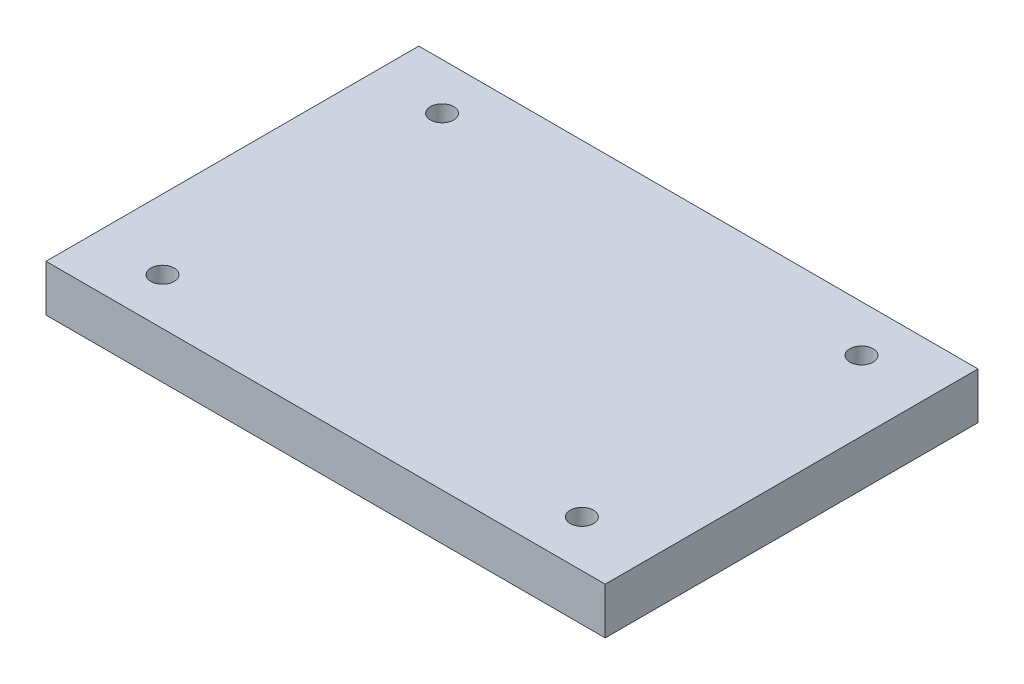
ISO-10303-21;
HEADER;
FILE_DESCRIPTION(('STEP AP214'),'2;1');
FILE_NAME('part.step','',(''),(''),'','','');
FILE_SCHEMA(('AUTOMOTIVE_DESIGN { 1 0 10303 214 1 1 1 1 }'));
ENDSEC;
DATA;
#1=APPLICATION_CONTEXT('core data for automotive mechanical design processes');
#2=APPLICATION_PROTOCOL_DEFINITION('international standard','automotive_design',2000,#1);
#3=PRODUCT_CONTEXT('',#1,'mechanical');
#4=PRODUCT('Part','Part','',(#3));
#5=PRODUCT_RELATED_PRODUCT_CATEGORY('part','',(#4));
#6=PRODUCT_DEFINITION_FORMATION('','',#4);
#7=PRODUCT_DEFINITION_CONTEXT('part definition',#1,'design');
#8=PRODUCT_DEFINITION('design','',#6,#7);
#9=PRODUCT_DEFINITION_SHAPE('','',#8);
#10=(LENGTH_UNIT() NAMED_UNIT(*) SI_UNIT(.MILLI.,.METRE.));
#11=(NAMED_UNIT(*) PLANE_ANGLE_UNIT() SI_UNIT($,.RADIAN.));
#12=(NAMED_UNIT(*) SI_UNIT($,.STERADIAN.) SOLID_ANGLE_UNIT());
#13=UNCERTAINTY_MEASURE_WITH_UNIT(LENGTH_MEASURE(1.E-05),#10,'distance_accuracy_value','');
#14=(GEOMETRIC_REPRESENTATION_CONTEXT(3) GLOBAL_UNCERTAINTY_ASSIGNED_CONTEXT((#13)) GLOBAL_UNIT_ASSIGNED_CONTEXT((#10,
#11,#12)) REPRESENTATION_CONTEXT('',''));
#15=CARTESIAN_POINT('',(0.,0.,0.));
#16=DIRECTION('',(0.,0.,1.));
#17=DIRECTION('',(1.,0.,0.));
#18=AXIS2_PLACEMENT_3D('',#15,#16,#17);
#19=CARTESIAN_POINT('',(-120.,-20.,80.));
#20=DIRECTION('',(-1.,0.,0.));
#21=DIRECTION('',(0.,0.,1.));
#22=AXIS2_PLACEMENT_3D('',#19,#20,#21);
#23=PLANE('',#22);
#24=DIRECTION('',(0.,0.,1.));
#25=VECTOR('',#24,1.);
#26=CARTESIAN_POINT('',(-120.,0.,80.));
#27=LINE('',#26,#25);
#28=CARTESIAN_POINT('',(-120.,0.,-80.));
#29=VERTEX_POINT('',#28);
#30=CARTESIAN_POINT('',(-120.,0.,80.));
#31=VERTEX_POINT('',#30);
#32=EDGE_CURVE('E102',#29,#31,#27,.T.);
#33=ORIENTED_EDGE('',*,*,#32,.F.);
#34=DIRECTION('',(0.,1.,0.));
#35=VECTOR('',#34,1.);
#36=CARTESIAN_POINT('',(-120.,-20.,-80.));
#37=LINE('',#36,#35);
#38=CARTESIAN_POINT('',(-120.,-20.,-80.));
#39=VERTEX_POINT('',#38);
#40=EDGE_CURVE('E11',#39,#29,#37,.T.);
#41=ORIENTED_EDGE('',*,*,#40,.F.);
#42=DIRECTION('',(0.,0.,1.));
#43=VECTOR('',#42,1.);
#44=CARTESIAN_POINT('',(-120.,-20.,80.));
#45=LINE('',#44,#43);
#46=CARTESIAN_POINT('',(-120.,-20.,80.));
#47=VERTEX_POINT('',#46);
#48=EDGE_CURVE('E100',#39,#47,#45,.T.);
#49=ORIENTED_EDGE('',*,*,#48,.T.);
#50=DIRECTION('',(0.,1.,0.));
#51=VECTOR('',#50,1.);
#52=CARTESIAN_POINT('',(-120.,-20.,80.));
#53=LINE('',#52,#51);
#54=EDGE_CURVE('E45',#47,#31,#53,.T.);
#55=ORIENTED_EDGE('',*,*,#54,.T.);
#56=EDGE_LOOP('',(#33,#41,#49,#55));
#57=FACE_BOUND('',#56,.T.);
#58=ADVANCED_FACE('F39',(#57),#23,.T.);
#59=CARTESIAN_POINT('',(-120.,-20.,-80.));
#60=DIRECTION('',(0.,0.,-1.));
#61=DIRECTION('',(-1.,0.,0.));
#62=AXIS2_PLACEMENT_3D('',#59,#60,#61);
#63=PLANE('',#62);
#64=DIRECTION('',(-1.,0.,0.));
#65=VECTOR('',#64,1.);
#66=CARTESIAN_POINT('',(-120.,0.,-80.));
#67=LINE('',#66,#65);
#68=CARTESIAN_POINT('',(120.,0.,-80.));
#69=VERTEX_POINT('',#68);
#70=EDGE_CURVE('E97',#69,#29,#67,.T.);
#71=ORIENTED_EDGE('',*,*,#70,.F.);
#72=DIRECTION('',(0.,1.,0.));
#73=VECTOR('',#72,1.);
#74=CARTESIAN_POINT('',(120.,-20.,-80.));
#75=LINE('',#74,#73);
#76=CARTESIAN_POINT('',(120.,-20.,-80.));
#77=VERTEX_POINT('',#76);
#78=EDGE_CURVE('E48',#77,#69,#75,.T.);
#79=ORIENTED_EDGE('',*,*,#78,.F.);
#80=DIRECTION('',(-1.,0.,0.));
#81=VECTOR('',#80,1.);
#82=CARTESIAN_POINT('',(-120.,-20.,-80.));
#83=LINE('',#82,#81);
#84=EDGE_CURVE('E94',#77,#39,#83,.T.);
#85=ORIENTED_EDGE('',*,*,#84,.T.);
#86=ORIENTED_EDGE('',*,*,#40,.T.);
#87=EDGE_LOOP('',(#71,#79,#85,#86));
#88=FACE_BOUND('',#87,.T.);
#89=ADVANCED_FACE('F113',(#88),#63,.T.);
#90=CARTESIAN_POINT('',(120.,-20.,80.));
#91=DIRECTION('',(1.,0.,0.));
#92=DIRECTION('',(0.,0.,-1.));
#93=AXIS2_PLACEMENT_3D('',#90,#91,#92);
#94=PLANE('',#93);
#95=DIRECTION('',(0.,0.,-1.));
#96=VECTOR('',#95,1.);
#97=CARTESIAN_POINT('',(120.,0.,80.));
#98=LINE('',#97,#96);
#99=CARTESIAN_POINT('',(120.,0.,80.));
#100=VERTEX_POINT('',#99);
#101=EDGE_CURVE('E90',#100,#69,#98,.T.);
#102=ORIENTED_EDGE('',*,*,#101,.F.);
#103=DIRECTION('',(0.,1.,0.));
#104=VECTOR('',#103,1.);
#105=CARTESIAN_POINT('',(120.,-20.,80.));
#106=LINE('',#105,#104);
#107=CARTESIAN_POINT('',(120.,-20.,80.));
#108=VERTEX_POINT('',#107);
#109=EDGE_CURVE('E81',#108,#100,#106,.T.);
#110=ORIENTED_EDGE('',*,*,#109,.F.);
#111=DIRECTION('',(0.,0.,-1.));
#112=VECTOR('',#111,1.);
#113=CARTESIAN_POINT('',(120.,-20.,80.));
#114=LINE('',#113,#112);
#115=EDGE_CURVE('E87',#108,#77,#114,.T.);
#116=ORIENTED_EDGE('',*,*,#115,.T.);
#117=ORIENTED_EDGE('',*,*,#78,.T.);
#118=EDGE_LOOP('',(#102,#110,#116,#117));
#119=FACE_BOUND('',#118,.T.);
#120=ADVANCED_FACE('F88',(#119),#94,.T.);
#121=CARTESIAN_POINT('',(-120.,-20.,80.));
#122=DIRECTION('',(0.,0.,1.));
#123=DIRECTION('',(1.,0.,0.));
#124=AXIS2_PLACEMENT_3D('',#121,#122,#123);
#125=PLANE('',#124);
#126=DIRECTION('',(1.,0.,0.));
#127=VECTOR('',#126,1.);
#128=CARTESIAN_POINT('',(-120.,0.,80.));
#129=LINE('',#128,#127);
#130=EDGE_CURVE('E110',#31,#100,#129,.T.);
#131=ORIENTED_EDGE('',*,*,#130,.F.);
#132=ORIENTED_EDGE('',*,*,#54,.F.);
#133=DIRECTION('',(1.,0.,0.));
#134=VECTOR('',#133,1.);
#135=CARTESIAN_POINT('',(-120.,-20.,80.));
#136=LINE('',#135,#134);
#137=EDGE_CURVE('E91',#47,#108,#136,.T.);
#138=ORIENTED_EDGE('',*,*,#137,.T.);
#139=ORIENTED_EDGE('',*,*,#109,.T.);
#140=EDGE_LOOP('',(#131,#132,#138,#139));
#141=FACE_BOUND('',#140,.T.);
#142=ADVANCED_FACE('F96',(#141),#125,.T.);
#143=CARTESIAN_POINT('',(0.,-20.,0.));
#144=DIRECTION('',(0.,-1.,0.));
#145=DIRECTION('',(0.,0.,-1.));
#146=AXIS2_PLACEMENT_3D('',#143,#144,#145);
#147=PLANE('',#146);
#148=CARTESIAN_POINT('',(-90.,-20.,-60.));
#149=DIRECTION('',(0.,1.,0.));
#150=DIRECTION('',(0.,0.,1.));
#151=AXIS2_PLACEMENT_3D('',#148,#149,#150);
#152=CIRCLE('',#151,5.00000000000001);
#153=CARTESIAN_POINT('',(-90.,-20.,-55.));
#154=VERTEX_POINT('',#153);
#155=EDGE_CURVE('E172',#154,#154,#152,.T.);
#156=ORIENTED_EDGE('',*,*,#155,.T.);
#157=EDGE_LOOP('',(#156));
#158=FACE_BOUND('',#157,.T.);
#159=CARTESIAN_POINT('',(90.,-20.,60.));
#160=DIRECTION('',(0.,1.,0.));
#161=DIRECTION('',(0.,0.,1.));
#162=AXIS2_PLACEMENT_3D('',#159,#160,#161);
#163=CIRCLE('',#162,5.00000000000001);
#164=CARTESIAN_POINT('',(90.,-20.,65.));
#165=VERTEX_POINT('',#164);
#166=EDGE_CURVE('E165',#165,#165,#163,.T.);
#167=ORIENTED_EDGE('',*,*,#166,.T.);
#168=EDGE_LOOP('',(#167));
#169=FACE_BOUND('',#168,.T.);
#170=CARTESIAN_POINT('',(-90.,-20.,60.));
#171=DIRECTION('',(0.,1.,0.));
#172=DIRECTION('',(0.,0.,1.));
#173=AXIS2_PLACEMENT_3D('',#170,#171,#172);
#174=CIRCLE('',#173,5.00000000000001);
#175=CARTESIAN_POINT('',(-90.,-20.,65.));
#176=VERTEX_POINT('',#175);
#177=EDGE_CURVE('E160',#176,#176,#174,.T.);
#178=ORIENTED_EDGE('',*,*,#177,.T.);
#179=EDGE_LOOP('',(#178));
#180=FACE_BOUND('',#179,.T.);
#181=CARTESIAN_POINT('',(90.,-20.,-60.));
#182=DIRECTION('',(0.,1.,0.));
#183=DIRECTION('',(0.,0.,1.));
#184=AXIS2_PLACEMENT_3D('',#181,#182,#183);
#185=CIRCLE('',#184,5.00000000000001);
#186=CARTESIAN_POINT('',(90.,-20.,-55.));
#187=VERTEX_POINT('',#186);
#188=EDGE_CURVE('E107',#187,#187,#185,.T.);
#189=ORIENTED_EDGE('',*,*,#188,.T.);
#190=EDGE_LOOP('',(#189));
#191=FACE_BOUND('',#190,.T.);
#192=ORIENTED_EDGE('',*,*,#48,.F.);
#193=ORIENTED_EDGE('',*,*,#84,.F.);
#194=ORIENTED_EDGE('',*,*,#115,.F.);
#195=ORIENTED_EDGE('',*,*,#137,.F.);
#196=EDGE_LOOP('',(#192,#193,#194,#195));
#197=FACE_BOUND('',#196,.T.);
#198=ADVANCED_FACE('F95',(#158,#169,#180,#191,#197),#147,.T.);
#199=CARTESIAN_POINT('',(0.,0.,0.));
#200=DIRECTION('',(0.,-1.,0.));
#201=DIRECTION('',(0.,0.,-1.));
#202=AXIS2_PLACEMENT_3D('',#199,#200,#201);
#203=PLANE('',#202);
#204=CARTESIAN_POINT('',(-90.,0.,-60.));
#205=DIRECTION('',(0.,1.,0.));
#206=DIRECTION('',(0.,0.,1.));
#207=AXIS2_PLACEMENT_3D('',#204,#205,#206);
#208=CIRCLE('',#207,5.00000000000001);
#209=CARTESIAN_POINT('',(-90.,0.,-55.));
#210=VERTEX_POINT('',#209);
#211=EDGE_CURVE('E166',#210,#210,#208,.T.);
#212=ORIENTED_EDGE('',*,*,#211,.F.);
#213=EDGE_LOOP('',(#212));
#214=FACE_BOUND('',#213,.T.);
#215=CARTESIAN_POINT('',(90.,0.,60.));
#216=DIRECTION('',(0.,1.,0.));
#217=DIRECTION('',(0.,0.,1.));
#218=AXIS2_PLACEMENT_3D('',#215,#216,#217);
#219=CIRCLE('',#218,5.00000000000001);
#220=CARTESIAN_POINT('',(90.,0.,65.));
#221=VERTEX_POINT('',#220);
#222=EDGE_CURVE('E164',#221,#221,#219,.T.);
#223=ORIENTED_EDGE('',*,*,#222,.F.);
#224=EDGE_LOOP('',(#223));
#225=FACE_BOUND('',#224,.T.);
#226=CARTESIAN_POINT('',(-90.,0.,60.));
#227=DIRECTION('',(0.,1.,0.));
#228=DIRECTION('',(0.,0.,1.));
#229=AXIS2_PLACEMENT_3D('',#226,#227,#228);
#230=CIRCLE('',#229,5.00000000000001);
#231=CARTESIAN_POINT('',(-90.,0.,65.));
#232=VERTEX_POINT('',#231);
#233=EDGE_CURVE('E159',#232,#232,#230,.T.);
#234=ORIENTED_EDGE('',*,*,#233,.F.);
#235=EDGE_LOOP('',(#234));
#236=FACE_BOUND('',#235,.T.);
#237=CARTESIAN_POINT('',(90.,0.,-60.));
#238=DIRECTION('',(0.,1.,0.));
#239=DIRECTION('',(0.,0.,1.));
#240=AXIS2_PLACEMENT_3D('',#237,#238,#239);
#241=CIRCLE('',#240,5.00000000000001);
#242=CARTESIAN_POINT('',(90.,0.,-55.));
#243=VERTEX_POINT('',#242);
#244=EDGE_CURVE('E174',#243,#243,#241,.T.);
#245=ORIENTED_EDGE('',*,*,#244,.F.);
#246=EDGE_LOOP('',(#245));
#247=FACE_BOUND('',#246,.T.);
#248=ORIENTED_EDGE('',*,*,#32,.T.);
#249=ORIENTED_EDGE('',*,*,#130,.T.);
#250=ORIENTED_EDGE('',*,*,#101,.T.);
#251=ORIENTED_EDGE('',*,*,#70,.T.);
#252=EDGE_LOOP('',(#248,#249,#250,#251));
#253=FACE_BOUND('',#252,.T.);
#254=ADVANCED_FACE('F111',(#214,#225,#236,#247,#253),#203,.F.);
#255=CARTESIAN_POINT('',(90.,-20.,-60.));
#256=DIRECTION('',(0.,1.,0.));
#257=DIRECTION('',(0.,0.,1.));
#258=AXIS2_PLACEMENT_3D('',#255,#256,#257);
#259=CYLINDRICAL_SURFACE('',#258,5.00000000000001);
#260=ORIENTED_EDGE('',*,*,#188,.F.);
#261=EDGE_LOOP('',(#260));
#262=FACE_BOUND('',#261,.T.);
#263=ORIENTED_EDGE('',*,*,#244,.T.);
#264=EDGE_LOOP('',(#263));
#265=FACE_BOUND('',#264,.T.);
#266=ADVANCED_FACE('F132',(#262,#265),#259,.F.);
#267=CARTESIAN_POINT('',(-90.,-20.,60.));
#268=DIRECTION('',(0.,1.,0.));
#269=DIRECTION('',(0.,0.,1.));
#270=AXIS2_PLACEMENT_3D('',#267,#268,#269);
#271=CYLINDRICAL_SURFACE('',#270,5.00000000000001);
#272=ORIENTED_EDGE('',*,*,#177,.F.);
#273=EDGE_LOOP('',(#272));
#274=FACE_BOUND('',#273,.T.);
#275=ORIENTED_EDGE('',*,*,#233,.T.);
#276=EDGE_LOOP('',(#275));
#277=FACE_BOUND('',#276,.T.);
#278=ADVANCED_FACE('F138',(#274,#277),#271,.F.);
#279=CARTESIAN_POINT('',(90.,-20.,60.));
#280=DIRECTION('',(0.,1.,0.));
#281=DIRECTION('',(0.,0.,1.));
#282=AXIS2_PLACEMENT_3D('',#279,#280,#281);
#283=CYLINDRICAL_SURFACE('',#282,5.00000000000001);
#284=ORIENTED_EDGE('',*,*,#166,.F.);
#285=EDGE_LOOP('',(#284));
#286=FACE_BOUND('',#285,.T.);
#287=ORIENTED_EDGE('',*,*,#222,.T.);
#288=EDGE_LOOP('',(#287));
#289=FACE_BOUND('',#288,.T.);
#290=ADVANCED_FACE('F142',(#286,#289),#283,.F.);
#291=CARTESIAN_POINT('',(-90.,-20.,-60.));
#292=DIRECTION('',(0.,1.,0.));
#293=DIRECTION('',(0.,0.,1.));
#294=AXIS2_PLACEMENT_3D('',#291,#292,#293);
#295=CYLINDRICAL_SURFACE('',#294,5.00000000000001);
#296=ORIENTED_EDGE('',*,*,#155,.F.);
#297=EDGE_LOOP('',(#296));
#298=FACE_BOUND('',#297,.T.);
#299=ORIENTED_EDGE('',*,*,#211,.T.);
#300=EDGE_LOOP('',(#299));
#301=FACE_BOUND('',#300,.T.);
#302=ADVANCED_FACE('F144',(#298,#301),#295,.F.);
#303=CLOSED_SHELL('',(#58,#89,#120,#142,#198,#254,#266,#278,#290,#302));
#304=MANIFOLD_SOLID_BREP('B2',#303);
#305=ADVANCED_BREP_SHAPE_REPRESENTATION('',(#18,#304),#14);
#306=SHAPE_DEFINITION_REPRESENTATION(#9,#305);
ENDSEC;
END-ISO-10303-21;
